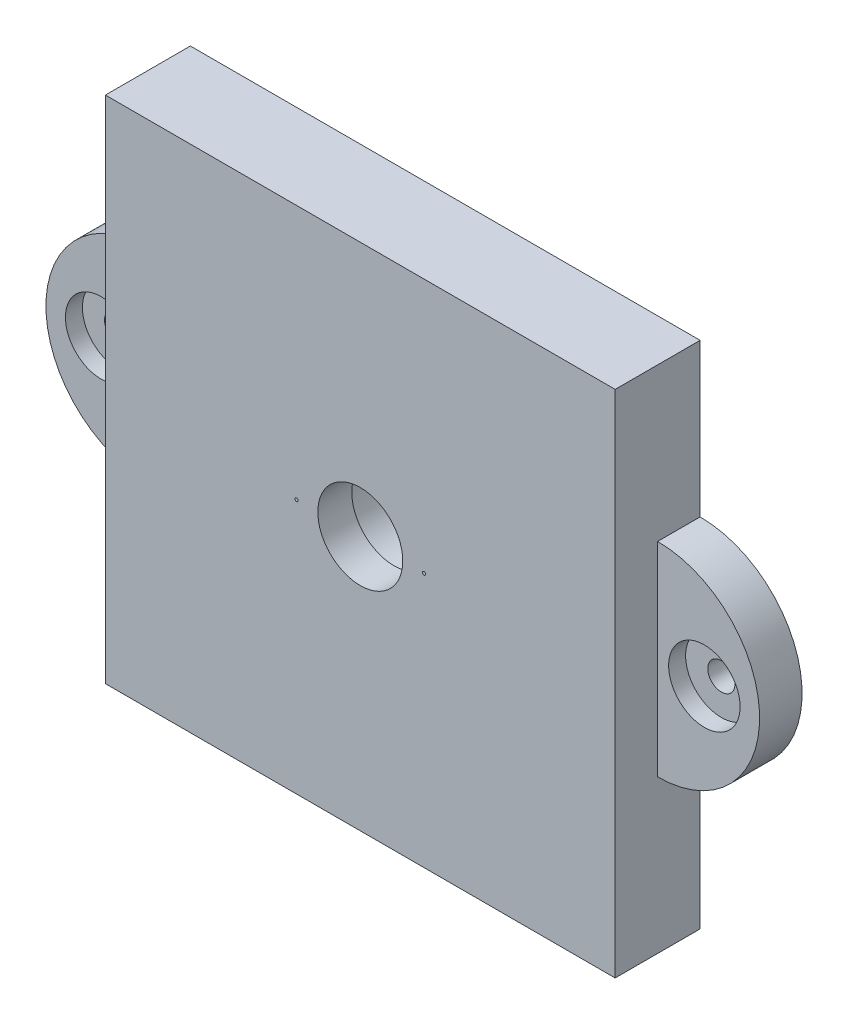
ISO-10303-21;
HEADER;
FILE_DESCRIPTION(('STEP AP214'),'2;1');
FILE_NAME('part.step','',(''),(''),'','','');
FILE_SCHEMA(('AUTOMOTIVE_DESIGN { 1 0 10303 214 1 1 1 1 }'));
ENDSEC;
DATA;
#1=APPLICATION_CONTEXT('core data for automotive mechanical design processes');
#2=APPLICATION_PROTOCOL_DEFINITION('international standard','automotive_design',2000,#1);
#3=PRODUCT_CONTEXT('',#1,'mechanical');
#4=PRODUCT('Part','Part','',(#3));
#5=PRODUCT_RELATED_PRODUCT_CATEGORY('part','',(#4));
#6=PRODUCT_DEFINITION_FORMATION('','',#4);
#7=PRODUCT_DEFINITION_CONTEXT('part definition',#1,'design');
#8=PRODUCT_DEFINITION('design','',#6,#7);
#9=PRODUCT_DEFINITION_SHAPE('','',#8);
#10=(LENGTH_UNIT() NAMED_UNIT(*) SI_UNIT(.MILLI.,.METRE.));
#11=(NAMED_UNIT(*) PLANE_ANGLE_UNIT() SI_UNIT($,.RADIAN.));
#12=(NAMED_UNIT(*) SI_UNIT($,.STERADIAN.) SOLID_ANGLE_UNIT());
#13=UNCERTAINTY_MEASURE_WITH_UNIT(LENGTH_MEASURE(1.E-05),#10,'distance_accuracy_value','');
#14=(GEOMETRIC_REPRESENTATION_CONTEXT(3) GLOBAL_UNCERTAINTY_ASSIGNED_CONTEXT((#13)) GLOBAL_UNIT_ASSIGNED_CONTEXT((#10,
#11,#12)) REPRESENTATION_CONTEXT('',''));
#15=CARTESIAN_POINT('',(0.,0.,0.));
#16=DIRECTION('',(0.,0.,1.));
#17=DIRECTION('',(1.,0.,0.));
#18=AXIS2_PLACEMENT_3D('',#15,#16,#17);
#19=CARTESIAN_POINT('',(0.,0.,6.));
#20=DIRECTION('',(0.,0.,-1.));
#21=DIRECTION('',(-1.,0.,0.));
#22=AXIS2_PLACEMENT_3D('',#19,#20,#21);
#23=PLANE('',#22);
#24=CARTESIAN_POINT('',(-0.751266961285343,-8.15775965528921,6.));
#25=DIRECTION('',(0.,0.,-1.));
#26=DIRECTION('',(-1.,0.,0.));
#27=AXIS2_PLACEMENT_3D('',#24,#25,#26);
#28=CIRCLE('',#27,5.);
#29=CARTESIAN_POINT('',(-5.75126696128534,-8.15775965528921,6.));
#30=VERTEX_POINT('',#29);
#31=EDGE_CURVE('E279',#30,#30,#28,.F.);
#32=ORIENTED_EDGE('',*,*,#31,.T.);
#33=EDGE_LOOP('',(#32));
#34=FACE_BOUND('',#33,.T.);
#35=CARTESIAN_POINT('',(-0.751266961285343,-8.15775965528921,6.));
#36=DIRECTION('',(0.,0.,-1.));
#37=DIRECTION('',(-1.,0.,0.));
#38=AXIS2_PLACEMENT_3D('',#35,#36,#37);
#39=CIRCLE('',#38,5.5);
#40=CARTESIAN_POINT('',(-6.25126696128534,-8.15775965528921,6.));
#41=VERTEX_POINT('',#40);
#42=EDGE_CURVE('E11',#41,#41,#39,.F.);
#43=ORIENTED_EDGE('',*,*,#42,.F.);
#44=EDGE_LOOP('',(#43));
#45=FACE_BOUND('',#44,.T.);
#46=ADVANCED_FACE('F45',(#34,#45),#23,.T.);
#47=CARTESIAN_POINT('',(29.2487330387146,-8.15775965528921,10.));
#48=DIRECTION('',(0.,0.,-1.));
#49=DIRECTION('',(-1.,0.,0.));
#50=AXIS2_PLACEMENT_3D('',#47,#48,#49);
#51=CYLINDRICAL_SURFACE('',#50,12.);
#52=CARTESIAN_POINT('',(29.2487330387146,-8.15775965528921,5.));
#53=DIRECTION('',(0.,0.,1.));
#54=DIRECTION('',(1.,0.,0.));
#55=AXIS2_PLACEMENT_3D('',#52,#53,#54);
#56=CIRCLE('',#55,12.);
#57=CARTESIAN_POINT('',(29.2487330387147,-20.1577596552892,5.));
#58=VERTEX_POINT('',#57);
#59=CARTESIAN_POINT('',(29.2487330387147,3.84224034471079,5.));
#60=VERTEX_POINT('',#59);
#61=EDGE_CURVE('E54',#58,#60,#56,.T.);
#62=ORIENTED_EDGE('',*,*,#61,.F.);
#63=DIRECTION('',(0.,0.,-1.));
#64=VECTOR('',#63,1.);
#65=CARTESIAN_POINT('',(29.2487330387147,-20.1577596552892,10.));
#66=LINE('',#65,#64);
#67=CARTESIAN_POINT('',(29.2487330387147,-20.1577596552892,0.));
#68=VERTEX_POINT('',#67);
#69=EDGE_CURVE('E344',#58,#68,#66,.T.);
#70=ORIENTED_EDGE('',*,*,#69,.T.);
#71=CARTESIAN_POINT('',(29.2487330387146,-8.15775965528921,0.));
#72=DIRECTION('',(0.,0.,1.));
#73=DIRECTION('',(-1.,0.,0.));
#74=AXIS2_PLACEMENT_3D('',#71,#72,#73);
#75=CIRCLE('',#74,12.);
#76=CARTESIAN_POINT('',(29.2487330387147,3.84224034471079,0.));
#77=VERTEX_POINT('',#76);
#78=EDGE_CURVE('E324',#68,#77,#75,.T.);
#79=ORIENTED_EDGE('',*,*,#78,.T.);
#80=DIRECTION('',(0.,0.,-1.));
#81=VECTOR('',#80,1.);
#82=CARTESIAN_POINT('',(29.2487330387147,3.84224034471079,10.));
#83=LINE('',#82,#81);
#84=EDGE_CURVE('E341',#60,#77,#83,.T.);
#85=ORIENTED_EDGE('',*,*,#84,.F.);
#86=EDGE_LOOP('',(#62,#70,#79,#85));
#87=FACE_BOUND('',#86,.T.);
#88=ADVANCED_FACE('F380',(#87),#51,.T.);
#89=CARTESIAN_POINT('',(-0.751266961285343,-8.15775965528921,0.));
#90=DIRECTION('',(0.,0.,1.));
#91=DIRECTION('',(1.,0.,0.));
#92=AXIS2_PLACEMENT_3D('',#89,#90,#91);
#93=CYLINDRICAL_SURFACE('',#92,5.);
#94=CARTESIAN_POINT('',(-0.751266961285343,-8.15775965528921,10.));
#95=DIRECTION('',(0.,0.,1.));
#96=DIRECTION('',(1.,0.,0.));
#97=AXIS2_PLACEMENT_3D('',#94,#95,#96);
#98=CIRCLE('',#97,5.);
#99=CARTESIAN_POINT('',(4.24873303871466,-8.15775965528921,10.));
#100=VERTEX_POINT('',#99);
#101=EDGE_CURVE('E288',#100,#100,#98,.T.);
#102=ORIENTED_EDGE('',*,*,#101,.T.);
#103=EDGE_LOOP('',(#102));
#104=FACE_BOUND('',#103,.T.);
#105=ORIENTED_EDGE('',*,*,#31,.F.);
#106=EDGE_LOOP('',(#105));
#107=FACE_BOUND('',#106,.T.);
#108=ADVANCED_FACE('F435',(#104,#107),#93,.F.);
#109=CARTESIAN_POINT('',(-30.7512669612853,-8.15775965528921,10.));
#110=DIRECTION('',(0.,0.,-1.));
#111=DIRECTION('',(-1.,0.,0.));
#112=AXIS2_PLACEMENT_3D('',#109,#110,#111);
#113=CYLINDRICAL_SURFACE('',#112,12.);
#114=DIRECTION('',(0.,0.,-1.));
#115=VECTOR('',#114,1.);
#116=CARTESIAN_POINT('',(-30.7512669612853,-20.1577596552892,10.));
#117=LINE('',#116,#115);
#118=CARTESIAN_POINT('',(-30.7512669612853,-20.1577596552892,5.));
#119=VERTEX_POINT('',#118);
#120=CARTESIAN_POINT('',(-30.7512669612853,-20.1577596552892,0.));
#121=VERTEX_POINT('',#120);
#122=EDGE_CURVE('E355',#119,#121,#117,.T.);
#123=ORIENTED_EDGE('',*,*,#122,.F.);
#124=CARTESIAN_POINT('',(-30.7512669612853,-8.15775965528921,5.));
#125=DIRECTION('',(0.,0.,-1.));
#126=DIRECTION('',(-1.,0.,0.));
#127=AXIS2_PLACEMENT_3D('',#124,#125,#126);
#128=CIRCLE('',#127,12.);
#129=CARTESIAN_POINT('',(-30.7512669612853,3.84224034471079,5.));
#130=VERTEX_POINT('',#129);
#131=EDGE_CURVE('E229',#119,#130,#128,.T.);
#132=ORIENTED_EDGE('',*,*,#131,.T.);
#133=DIRECTION('',(0.,0.,-1.));
#134=VECTOR('',#133,1.);
#135=CARTESIAN_POINT('',(-30.7512669612853,3.84224034471079,10.));
#136=LINE('',#135,#134);
#137=CARTESIAN_POINT('',(-30.7512669612853,3.84224034471079,0.));
#138=VERTEX_POINT('',#137);
#139=EDGE_CURVE('E358',#130,#138,#136,.T.);
#140=ORIENTED_EDGE('',*,*,#139,.T.);
#141=CARTESIAN_POINT('',(-30.7512669612853,-8.15775965528921,0.));
#142=DIRECTION('',(0.,0.,1.));
#143=DIRECTION('',(-1.,0.,0.));
#144=AXIS2_PLACEMENT_3D('',#141,#142,#143);
#145=CIRCLE('',#144,12.);
#146=EDGE_CURVE('E310',#138,#121,#145,.T.);
#147=ORIENTED_EDGE('',*,*,#146,.T.);
#148=EDGE_LOOP('',(#123,#132,#140,#147));
#149=FACE_BOUND('',#148,.T.);
#150=ADVANCED_FACE('F47',(#149),#113,.T.);
#151=CARTESIAN_POINT('',(-30.7512669612853,-20.1577596552892,10.));
#152=DIRECTION('',(1.,0.,0.));
#153=DIRECTION('',(0.,1.,0.));
#154=AXIS2_PLACEMENT_3D('',#151,#152,#153);
#155=PLANE('',#154);
#156=DIRECTION('',(0.,0.,-1.));
#157=VECTOR('',#156,1.);
#158=CARTESIAN_POINT('',(-30.7512669612853,-38.1577596552892,10.));
#159=LINE('',#158,#157);
#160=CARTESIAN_POINT('',(-30.7512669612853,-38.1577596552892,10.));
#161=VERTEX_POINT('',#160);
#162=CARTESIAN_POINT('',(-30.7512669612853,-38.1577596552892,0.));
#163=VERTEX_POINT('',#162);
#164=EDGE_CURVE('E351',#161,#163,#159,.T.);
#165=ORIENTED_EDGE('',*,*,#164,.F.);
#166=DIRECTION('',(0.,-1.,0.));
#167=VECTOR('',#166,1.);
#168=CARTESIAN_POINT('',(-30.7512669612853,21.8422403447108,10.));
#169=LINE('',#168,#167);
#170=CARTESIAN_POINT('',(-30.7512669612853,21.8422403447108,10.));
#171=VERTEX_POINT('',#170);
#172=EDGE_CURVE('E293',#171,#161,#169,.T.);
#173=ORIENTED_EDGE('',*,*,#172,.F.);
#174=DIRECTION('',(0.,0.,-1.));
#175=VECTOR('',#174,1.);
#176=CARTESIAN_POINT('',(-30.7512669612853,21.8422403447108,10.));
#177=LINE('',#176,#175);
#178=CARTESIAN_POINT('',(-30.7512669612853,21.8422403447108,0.));
#179=VERTEX_POINT('',#178);
#180=EDGE_CURVE('E306',#171,#179,#177,.T.);
#181=ORIENTED_EDGE('',*,*,#180,.T.);
#182=DIRECTION('',(0.,-1.,0.));
#183=VECTOR('',#182,1.);
#184=CARTESIAN_POINT('',(-30.7512669612853,21.8422403447108,0.));
#185=LINE('',#184,#183);
#186=EDGE_CURVE('E292',#179,#138,#185,.T.);
#187=ORIENTED_EDGE('',*,*,#186,.T.);
#188=ORIENTED_EDGE('',*,*,#139,.F.);
#189=DIRECTION('',(0.,1.,0.));
#190=VECTOR('',#189,1.);
#191=CARTESIAN_POINT('',(-30.7512669612853,3.84224034471079,5.));
#192=LINE('',#191,#190);
#193=EDGE_CURVE('E226',#119,#130,#192,.T.);
#194=ORIENTED_EDGE('',*,*,#193,.F.);
#195=ORIENTED_EDGE('',*,*,#122,.T.);
#196=DIRECTION('',(0.,-1.,0.));
#197=VECTOR('',#196,1.);
#198=CARTESIAN_POINT('',(-30.7512669612853,-20.1577596552892,0.));
#199=LINE('',#198,#197);
#200=EDGE_CURVE('E314',#121,#163,#199,.T.);
#201=ORIENTED_EDGE('',*,*,#200,.T.);
#202=EDGE_LOOP('',(#165,#173,#181,#187,#188,#194,#195,#201));
#203=FACE_BOUND('',#202,.T.);
#204=ADVANCED_FACE('F404',(#203),#155,.F.);
#205=CARTESIAN_POINT('',(-30.7512669612853,-38.1577596552892,10.));
#206=DIRECTION('',(0.,1.,0.));
#207=DIRECTION('',(0.,0.,1.));
#208=AXIS2_PLACEMENT_3D('',#205,#206,#207);
#209=PLANE('',#208);
#210=DIRECTION('',(1.,0.,0.));
#211=VECTOR('',#210,1.);
#212=CARTESIAN_POINT('',(-30.7512669612853,-38.1577596552892,0.));
#213=LINE('',#212,#211);
#214=CARTESIAN_POINT('',(29.2487330387147,-38.1577596552892,0.));
#215=VERTEX_POINT('',#214);
#216=EDGE_CURVE('E317',#163,#215,#213,.T.);
#217=ORIENTED_EDGE('',*,*,#216,.T.);
#218=DIRECTION('',(0.,0.,-1.));
#219=VECTOR('',#218,1.);
#220=CARTESIAN_POINT('',(29.2487330387147,-38.1577596552892,10.));
#221=LINE('',#220,#219);
#222=CARTESIAN_POINT('',(29.2487330387147,-38.1577596552892,10.));
#223=VERTEX_POINT('',#222);
#224=EDGE_CURVE('E347',#223,#215,#221,.T.);
#225=ORIENTED_EDGE('',*,*,#224,.F.);
#226=DIRECTION('',(1.,0.,0.));
#227=VECTOR('',#226,1.);
#228=CARTESIAN_POINT('',(-30.7512669612853,-38.1577596552892,10.));
#229=LINE('',#228,#227);
#230=EDGE_CURVE('E296',#161,#223,#229,.T.);
#231=ORIENTED_EDGE('',*,*,#230,.F.);
#232=ORIENTED_EDGE('',*,*,#164,.T.);
#233=EDGE_LOOP('',(#217,#225,#231,#232));
#234=FACE_BOUND('',#233,.T.);
#235=ADVANCED_FACE('F402',(#234),#209,.F.);
#236=CARTESIAN_POINT('',(29.2487330387146,21.8422403447108,10.));
#237=DIRECTION('',(-1.,0.,0.));
#238=DIRECTION('',(0.,-1.,0.));
#239=AXIS2_PLACEMENT_3D('',#236,#237,#238);
#240=PLANE('',#239);
#241=DIRECTION('',(0.,0.,-1.));
#242=VECTOR('',#241,1.);
#243=CARTESIAN_POINT('',(29.2487330387146,21.8422403447108,10.));
#244=LINE('',#243,#242);
#245=CARTESIAN_POINT('',(29.2487330387146,21.8422403447108,10.));
#246=VERTEX_POINT('',#245);
#247=CARTESIAN_POINT('',(29.2487330387146,21.8422403447108,0.));
#248=VERTEX_POINT('',#247);
#249=EDGE_CURVE('E337',#246,#248,#244,.T.);
#250=ORIENTED_EDGE('',*,*,#249,.F.);
#251=DIRECTION('',(0.,1.,0.));
#252=VECTOR('',#251,1.);
#253=CARTESIAN_POINT('',(29.2487330387147,-20.1577596552892,10.));
#254=LINE('',#253,#252);
#255=EDGE_CURVE('E300',#223,#246,#254,.T.);
#256=ORIENTED_EDGE('',*,*,#255,.F.);
#257=ORIENTED_EDGE('',*,*,#224,.T.);
#258=DIRECTION('',(0.,1.,0.));
#259=VECTOR('',#258,1.);
#260=CARTESIAN_POINT('',(29.2487330387147,-20.1577596552892,0.));
#261=LINE('',#260,#259);
#262=EDGE_CURVE('E320',#215,#68,#261,.T.);
#263=ORIENTED_EDGE('',*,*,#262,.T.);
#264=ORIENTED_EDGE('',*,*,#69,.F.);
#265=DIRECTION('',(0.,-1.,0.));
#266=VECTOR('',#265,1.);
#267=CARTESIAN_POINT('',(29.2487330387147,3.84224034471079,5.));
#268=LINE('',#267,#266);
#269=EDGE_CURVE('E225',#60,#58,#268,.T.);
#270=ORIENTED_EDGE('',*,*,#269,.F.);
#271=ORIENTED_EDGE('',*,*,#84,.T.);
#272=DIRECTION('',(0.,1.,0.));
#273=VECTOR('',#272,1.);
#274=CARTESIAN_POINT('',(29.2487330387146,21.8422403447108,0.));
#275=LINE('',#274,#273);
#276=EDGE_CURVE('E328',#77,#248,#275,.T.);
#277=ORIENTED_EDGE('',*,*,#276,.T.);
#278=EDGE_LOOP('',(#250,#256,#257,#263,#264,#270,#271,#277));
#279=FACE_BOUND('',#278,.T.);
#280=ADVANCED_FACE('F379',(#279),#240,.F.);
#281=CARTESIAN_POINT('',(-30.7512669612853,21.8422403447108,10.));
#282=DIRECTION('',(0.,-1.,0.));
#283=DIRECTION('',(0.,0.,-1.));
#284=AXIS2_PLACEMENT_3D('',#281,#282,#283);
#285=PLANE('',#284);
#286=DIRECTION('',(-1.,0.,0.));
#287=VECTOR('',#286,1.);
#288=CARTESIAN_POINT('',(-30.7512669612853,21.8422403447108,0.));
#289=LINE('',#288,#287);
#290=EDGE_CURVE('E297',#248,#179,#289,.T.);
#291=ORIENTED_EDGE('',*,*,#290,.T.);
#292=ORIENTED_EDGE('',*,*,#180,.F.);
#293=DIRECTION('',(-1.,0.,0.));
#294=VECTOR('',#293,1.);
#295=CARTESIAN_POINT('',(1.24873303871465,21.8422403447108,10.));
#296=LINE('',#295,#294);
#297=EDGE_CURVE('E303',#246,#171,#296,.T.);
#298=ORIENTED_EDGE('',*,*,#297,.F.);
#299=ORIENTED_EDGE('',*,*,#249,.T.);
#300=EDGE_LOOP('',(#291,#292,#298,#299));
#301=FACE_BOUND('',#300,.T.);
#302=ADVANCED_FACE('F390',(#301),#285,.F.);
#303=CARTESIAN_POINT('',(-30.7512669612853,-8.15775965528921,10.));
#304=DIRECTION('',(0.,0.,-1.));
#305=DIRECTION('',(-1.,0.,0.));
#306=AXIS2_PLACEMENT_3D('',#303,#304,#305);
#307=PLANE('',#306);
#308=CARTESIAN_POINT('',(-8.25126696128534,-8.15775965528921,10.));
#309=DIRECTION('',(0.,0.,-1.));
#310=DIRECTION('',(-1.,0.,0.));
#311=AXIS2_PLACEMENT_3D('',#308,#309,#310);
#312=CIRCLE('',#311,0.185720517649482);
#313=CARTESIAN_POINT('',(-8.43698747893482,-8.15775965528921,10.));
#314=VERTEX_POINT('',#313);
#315=EDGE_CURVE('E239',#314,#314,#312,.T.);
#316=ORIENTED_EDGE('',*,*,#315,.T.);
#317=EDGE_LOOP('',(#316));
#318=FACE_BOUND('',#317,.T.);
#319=CARTESIAN_POINT('',(6.74873303871466,-8.15775965528921,10.));
#320=DIRECTION('',(0.,0.,-1.));
#321=DIRECTION('',(-1.,0.,0.));
#322=AXIS2_PLACEMENT_3D('',#319,#320,#321);
#323=CIRCLE('',#322,0.185720517649481);
#324=CARTESIAN_POINT('',(6.56301252106518,-8.15775965528921,10.));
#325=VERTEX_POINT('',#324);
#326=EDGE_CURVE('E244',#325,#325,#323,.T.);
#327=ORIENTED_EDGE('',*,*,#326,.T.);
#328=EDGE_LOOP('',(#327));
#329=FACE_BOUND('',#328,.T.);
#330=ORIENTED_EDGE('',*,*,#101,.F.);
#331=EDGE_LOOP('',(#330));
#332=FACE_BOUND('',#331,.T.);
#333=ORIENTED_EDGE('',*,*,#172,.T.);
#334=ORIENTED_EDGE('',*,*,#230,.T.);
#335=ORIENTED_EDGE('',*,*,#255,.T.);
#336=ORIENTED_EDGE('',*,*,#297,.T.);
#337=EDGE_LOOP('',(#333,#334,#335,#336));
#338=FACE_BOUND('',#337,.T.);
#339=ADVANCED_FACE('F394',(#318,#329,#332,#338),#307,.F.);
#340=CARTESIAN_POINT('',(-30.7512669612853,-8.15775965528921,0.));
#341=DIRECTION('',(0.,0.,-1.));
#342=DIRECTION('',(-1.,0.,0.));
#343=AXIS2_PLACEMENT_3D('',#340,#341,#342);
#344=PLANE('',#343);
#345=CARTESIAN_POINT('',(34.7487330387147,-8.15775965528921,0.));
#346=DIRECTION('',(0.,0.,1.));
#347=DIRECTION('',(1.,0.,0.));
#348=AXIS2_PLACEMENT_3D('',#345,#346,#347);
#349=CIRCLE('',#348,1.6);
#350=CARTESIAN_POINT('',(36.3487330387146,-8.15775965528921,0.));
#351=VERTEX_POINT('',#350);
#352=EDGE_CURVE('E205',#351,#351,#349,.T.);
#353=ORIENTED_EDGE('',*,*,#352,.T.);
#354=EDGE_LOOP('',(#353));
#355=FACE_BOUND('',#354,.T.);
#356=CARTESIAN_POINT('',(-36.2512669612853,-8.15775965528921,0.));
#357=DIRECTION('',(0.,0.,1.));
#358=DIRECTION('',(1.,0.,0.));
#359=AXIS2_PLACEMENT_3D('',#356,#357,#358);
#360=CIRCLE('',#359,1.6);
#361=CARTESIAN_POINT('',(-34.6512669612853,-8.15775965528921,0.));
#362=VERTEX_POINT('',#361);
#363=EDGE_CURVE('E221',#362,#362,#360,.T.);
#364=ORIENTED_EDGE('',*,*,#363,.T.);
#365=EDGE_LOOP('',(#364));
#366=FACE_BOUND('',#365,.T.);
#367=DIRECTION('',(0.,-1.,0.));
#368=VECTOR('',#367,1.);
#369=CARTESIAN_POINT('',(27.2487330387147,19.8422403447108,0.));
#370=LINE('',#369,#368);
#371=CARTESIAN_POINT('',(27.2487330387147,19.8422403447108,0.));
#372=VERTEX_POINT('',#371);
#373=CARTESIAN_POINT('',(27.2487330387146,-36.1577596552892,0.));
#374=VERTEX_POINT('',#373);
#375=EDGE_CURVE('E69',#372,#374,#370,.T.);
#376=ORIENTED_EDGE('',*,*,#375,.F.);
#377=DIRECTION('',(1.,0.,0.));
#378=VECTOR('',#377,1.);
#379=CARTESIAN_POINT('',(27.2487330387147,19.8422403447108,0.));
#380=LINE('',#379,#378);
#381=CARTESIAN_POINT('',(-28.7512669612853,19.8422403447108,0.));
#382=VERTEX_POINT('',#381);
#383=EDGE_CURVE('E250',#382,#372,#380,.T.);
#384=ORIENTED_EDGE('',*,*,#383,.F.);
#385=DIRECTION('',(0.,1.,0.));
#386=VECTOR('',#385,1.);
#387=CARTESIAN_POINT('',(-28.7512669612853,19.8422403447108,0.));
#388=LINE('',#387,#386);
#389=CARTESIAN_POINT('',(-28.7512669612853,-36.1577596552892,0.));
#390=VERTEX_POINT('',#389);
#391=EDGE_CURVE('E269',#390,#382,#388,.T.);
#392=ORIENTED_EDGE('',*,*,#391,.F.);
#393=DIRECTION('',(-1.,0.,0.));
#394=VECTOR('',#393,1.);
#395=CARTESIAN_POINT('',(27.2487330387146,-36.1577596552892,0.));
#396=LINE('',#395,#394);
#397=EDGE_CURVE('E265',#374,#390,#396,.T.);
#398=ORIENTED_EDGE('',*,*,#397,.F.);
#399=EDGE_LOOP('',(#376,#384,#392,#398));
#400=FACE_BOUND('',#399,.T.);
#401=ORIENTED_EDGE('',*,*,#186,.F.);
#402=ORIENTED_EDGE('',*,*,#290,.F.);
#403=ORIENTED_EDGE('',*,*,#276,.F.);
#404=ORIENTED_EDGE('',*,*,#78,.F.);
#405=ORIENTED_EDGE('',*,*,#262,.F.);
#406=ORIENTED_EDGE('',*,*,#216,.F.);
#407=ORIENTED_EDGE('',*,*,#200,.F.);
#408=ORIENTED_EDGE('',*,*,#146,.F.);
#409=EDGE_LOOP('',(#401,#402,#403,#404,#405,#406,#407,#408));
#410=FACE_BOUND('',#409,.T.);
#411=ADVANCED_FACE('F386',(#355,#366,#400,#410),#344,.T.);
#412=DIRECTION('',(0.,-1.,0.));
#413=VECTOR('',#412,1.);
#414=CARTESIAN_POINT('',(13.2487330387147,-0.157759655289209,6.));
#415=LINE('',#414,#413);
#416=CARTESIAN_POINT('',(13.2487330387147,-0.157759655289209,6.));
#417=VERTEX_POINT('',#416);
#418=CARTESIAN_POINT('',(13.2487330387147,-16.1577596552892,6.));
#419=VERTEX_POINT('',#418);
#420=EDGE_CURVE('E453',#417,#419,#415,.T.);
#421=ORIENTED_EDGE('',*,*,#420,.F.);
#422=DIRECTION('',(1.,0.,0.));
#423=VECTOR('',#422,1.);
#424=CARTESIAN_POINT('',(13.2487330387147,-0.157759655289209,6.));
#425=LINE('',#424,#423);
#426=CARTESIAN_POINT('',(-14.7512669612853,-0.157759655289209,6.));
#427=VERTEX_POINT('',#426);
#428=EDGE_CURVE('E185',#427,#417,#425,.T.);
#429=ORIENTED_EDGE('',*,*,#428,.F.);
#430=DIRECTION('',(0.,1.,0.));
#431=VECTOR('',#430,1.);
#432=CARTESIAN_POINT('',(-14.7512669612853,-0.157759655289209,6.));
#433=LINE('',#432,#431);
#434=CARTESIAN_POINT('',(-14.7512669612854,-16.1577596552892,6.));
#435=VERTEX_POINT('',#434);
#436=EDGE_CURVE('E181',#435,#427,#433,.T.);
#437=ORIENTED_EDGE('',*,*,#436,.F.);
#438=DIRECTION('',(-1.,0.,0.));
#439=VECTOR('',#438,1.);
#440=CARTESIAN_POINT('',(13.2487330387147,-16.1577596552892,6.));
#441=LINE('',#440,#439);
#442=EDGE_CURVE('E756',#419,#435,#441,.T.);
#443=ORIENTED_EDGE('',*,*,#442,.F.);
#444=EDGE_LOOP('',(#421,#429,#437,#443));
#445=FACE_BOUND('',#444,.T.);
#446=DIRECTION('',(0.,-1.,0.));
#447=VECTOR('',#446,1.);
#448=CARTESIAN_POINT('',(27.2487330387147,19.8422403447108,6.));
#449=LINE('',#448,#447);
#450=CARTESIAN_POINT('',(27.2487330387147,19.8422403447108,6.));
#451=VERTEX_POINT('',#450);
#452=CARTESIAN_POINT('',(27.2487330387146,-36.1577596552892,6.));
#453=VERTEX_POINT('',#452);
#454=EDGE_CURVE('E245',#451,#453,#449,.T.);
#455=ORIENTED_EDGE('',*,*,#454,.T.);
#456=DIRECTION('',(-1.,0.,0.));
#457=VECTOR('',#456,1.);
#458=CARTESIAN_POINT('',(27.2487330387146,-36.1577596552892,6.));
#459=LINE('',#458,#457);
#460=CARTESIAN_POINT('',(-28.7512669612853,-36.1577596552892,6.));
#461=VERTEX_POINT('',#460);
#462=EDGE_CURVE('E249',#453,#461,#459,.T.);
#463=ORIENTED_EDGE('',*,*,#462,.T.);
#464=DIRECTION('',(0.,1.,0.));
#465=VECTOR('',#464,1.);
#466=CARTESIAN_POINT('',(-28.7512669612853,19.8422403447108,6.));
#467=LINE('',#466,#465);
#468=CARTESIAN_POINT('',(-28.7512669612853,19.8422403447108,6.));
#469=VERTEX_POINT('',#468);
#470=EDGE_CURVE('E254',#461,#469,#467,.T.);
#471=ORIENTED_EDGE('',*,*,#470,.T.);
#472=DIRECTION('',(1.,0.,0.));
#473=VECTOR('',#472,1.);
#474=CARTESIAN_POINT('',(27.2487330387147,19.8422403447108,6.));
#475=LINE('',#474,#473);
#476=EDGE_CURVE('E258',#469,#451,#475,.T.);
#477=ORIENTED_EDGE('',*,*,#476,.T.);
#478=EDGE_LOOP('',(#455,#463,#471,#477));
#479=FACE_BOUND('',#478,.T.);
#480=ADVANCED_FACE('F429',(#445,#479),#23,.T.);
#481=CARTESIAN_POINT('',(27.2487330387147,19.8422403447108,6.));
#482=DIRECTION('',(1.,0.,0.));
#483=DIRECTION('',(0.,1.,0.));
#484=AXIS2_PLACEMENT_3D('',#481,#482,#483);
#485=PLANE('',#484);
#486=ORIENTED_EDGE('',*,*,#375,.T.);
#487=DIRECTION('',(0.,0.,-1.));
#488=VECTOR('',#487,1.);
#489=CARTESIAN_POINT('',(27.2487330387146,-36.1577596552892,6.));
#490=LINE('',#489,#488);
#491=EDGE_CURVE('E262',#453,#374,#490,.T.);
#492=ORIENTED_EDGE('',*,*,#491,.F.);
#493=ORIENTED_EDGE('',*,*,#454,.F.);
#494=DIRECTION('',(0.,0.,-1.));
#495=VECTOR('',#494,1.);
#496=CARTESIAN_POINT('',(27.2487330387147,19.8422403447108,6.));
#497=LINE('',#496,#495);
#498=EDGE_CURVE('E276',#451,#372,#497,.T.);
#499=ORIENTED_EDGE('',*,*,#498,.T.);
#500=EDGE_LOOP('',(#486,#492,#493,#499));
#501=FACE_BOUND('',#500,.T.);
#502=ADVANCED_FACE('F440',(#501),#485,.F.);
#503=CARTESIAN_POINT('',(27.2487330387147,19.8422403447108,6.));
#504=DIRECTION('',(0.,1.,0.));
#505=DIRECTION('',(0.,0.,1.));
#506=AXIS2_PLACEMENT_3D('',#503,#504,#505);
#507=PLANE('',#506);
#508=ORIENTED_EDGE('',*,*,#383,.T.);
#509=ORIENTED_EDGE('',*,*,#498,.F.);
#510=ORIENTED_EDGE('',*,*,#476,.F.);
#511=DIRECTION('',(0.,0.,-1.));
#512=VECTOR('',#511,1.);
#513=CARTESIAN_POINT('',(-28.7512669612853,19.8422403447108,6.));
#514=LINE('',#513,#512);
#515=EDGE_CURVE('E280',#469,#382,#514,.T.);
#516=ORIENTED_EDGE('',*,*,#515,.T.);
#517=EDGE_LOOP('',(#508,#509,#510,#516));
#518=FACE_BOUND('',#517,.T.);
#519=ADVANCED_FACE('F446',(#518),#507,.F.);
#520=CARTESIAN_POINT('',(-28.7512669612853,19.8422403447108,6.));
#521=DIRECTION('',(-1.,0.,0.));
#522=DIRECTION('',(0.,-1.,0.));
#523=AXIS2_PLACEMENT_3D('',#520,#521,#522);
#524=PLANE('',#523);
#525=ORIENTED_EDGE('',*,*,#391,.T.);
#526=ORIENTED_EDGE('',*,*,#515,.F.);
#527=ORIENTED_EDGE('',*,*,#470,.F.);
#528=DIRECTION('',(0.,0.,-1.));
#529=VECTOR('',#528,1.);
#530=CARTESIAN_POINT('',(-28.7512669612853,-36.1577596552892,6.));
#531=LINE('',#530,#529);
#532=EDGE_CURVE('E283',#461,#390,#531,.T.);
#533=ORIENTED_EDGE('',*,*,#532,.T.);
#534=EDGE_LOOP('',(#525,#526,#527,#533));
#535=FACE_BOUND('',#534,.T.);
#536=ADVANCED_FACE('F463',(#535),#524,.F.);
#537=CARTESIAN_POINT('',(27.2487330387146,-36.1577596552892,6.));
#538=DIRECTION('',(0.,-1.,0.));
#539=DIRECTION('',(0.,0.,-1.));
#540=AXIS2_PLACEMENT_3D('',#537,#538,#539);
#541=PLANE('',#540);
#542=ORIENTED_EDGE('',*,*,#397,.T.);
#543=ORIENTED_EDGE('',*,*,#532,.F.);
#544=ORIENTED_EDGE('',*,*,#462,.F.);
#545=ORIENTED_EDGE('',*,*,#491,.T.);
#546=EDGE_LOOP('',(#542,#543,#544,#545));
#547=FACE_BOUND('',#546,.T.);
#548=ADVANCED_FACE('F459',(#547),#541,.F.);
#549=CARTESIAN_POINT('',(6.74873303871466,-8.15775965528921,9.));
#550=DIRECTION('',(0.,0.,-1.));
#551=DIRECTION('',(-1.,0.,0.));
#552=AXIS2_PLACEMENT_3D('',#549,#550,#551);
#553=CONICAL_SURFACE('',#552,1.85,1.02974425867665);
#554=CARTESIAN_POINT('',(6.74873303871466,-8.15775965528921,9.));
#555=DIRECTION('',(0.,0.,-1.));
#556=DIRECTION('',(-1.,0.,0.));
#557=AXIS2_PLACEMENT_3D('',#554,#555,#556);
#558=CIRCLE('',#557,1.85);
#559=CARTESIAN_POINT('',(4.89873303871466,-8.15775965528921,9.));
#560=VERTEX_POINT('',#559);
#561=EDGE_CURVE('E240',#560,#560,#558,.T.);
#562=CARTESIAN_POINT('',(4.89873303871466,-8.15775965528921,9.));
#563=CARTESIAN_POINT('',(4.91606928332248,-8.15775965528921,9.01041666666667));
#564=CARTESIAN_POINT('',(4.93340552793029,-8.15775965528921,9.02083333333333));
#565=CARTESIAN_POINT('',(4.96807801714593,-8.15775965528921,9.04166666666667));
#566=CARTESIAN_POINT('',(4.98541426175375,-8.15775965528921,9.05208333333333));
#567=CARTESIAN_POINT('',(5.02008675096938,-8.15775965528921,9.07291666666667));
#568=CARTESIAN_POINT('',(5.0374229955772,-8.15775965528921,9.08333333333333));
#569=CARTESIAN_POINT('',(5.07209548479284,-8.15775965528921,9.10416666666667));
#570=CARTESIAN_POINT('',(5.08943172940066,-8.15775965528921,9.11458333333333));
#571=CARTESIAN_POINT('',(5.12410421861629,-8.15775965528921,9.13541666666667));
#572=CARTESIAN_POINT('',(5.14144046322411,-8.15775965528921,9.14583333333333));
#573=CARTESIAN_POINT('',(5.17611295243975,-8.15775965528921,9.16666666666667));
#574=CARTESIAN_POINT('',(5.19344919704756,-8.15775965528921,9.17708333333333));
#575=CARTESIAN_POINT('',(5.2281216862632,-8.15775965528921,9.19791666666667));
#576=CARTESIAN_POINT('',(5.24545793087102,-8.15775965528921,9.20833333333333));
#577=CARTESIAN_POINT('',(5.28013042008665,-8.15775965528921,9.22916666666667));
#578=CARTESIAN_POINT('',(5.29746666469447,-8.15775965528921,9.23958333333333));
#579=CARTESIAN_POINT('',(5.33213915391011,-8.15775965528921,9.26041666666667));
#580=CARTESIAN_POINT('',(5.34947539851792,-8.15775965528921,9.27083333333333));
#581=CARTESIAN_POINT('',(5.38414788773356,-8.15775965528921,9.29166666666667));
#582=CARTESIAN_POINT('',(5.40148413234138,-8.15775965528921,9.30208333333333));
#583=CARTESIAN_POINT('',(5.43615662155701,-8.15775965528921,9.32291666666667));
#584=CARTESIAN_POINT('',(5.45349286616483,-8.15775965528921,9.33333333333333));
#585=CARTESIAN_POINT('',(5.48816535538047,-8.15775965528921,9.35416666666667));
#586=CARTESIAN_POINT('',(5.50550159998829,-8.15775965528921,9.36458333333333));
#587=CARTESIAN_POINT('',(5.54017408920392,-8.15775965528921,9.38541666666667));
#588=CARTESIAN_POINT('',(5.55751033381174,-8.15775965528921,9.39583333333333));
#589=CARTESIAN_POINT('',(5.59218282302737,-8.15775965528921,9.41666666666667));
#590=CARTESIAN_POINT('',(5.60951906763519,-8.15775965528921,9.42708333333333));
#591=CARTESIAN_POINT('',(5.64419155685083,-8.15775965528921,9.44791666666667));
#592=CARTESIAN_POINT('',(5.66152780145865,-8.15775965528921,9.45833333333333));
#593=CARTESIAN_POINT('',(5.69620029067428,-8.15775965528921,9.47916666666667));
#594=CARTESIAN_POINT('',(5.7135365352821,-8.15775965528921,9.48958333333333));
#595=CARTESIAN_POINT('',(5.74820902449774,-8.15775965528921,9.51041666666667));
#596=CARTESIAN_POINT('',(5.76554526910555,-8.15775965528921,9.52083333333333));
#597=CARTESIAN_POINT('',(5.80021775832119,-8.15775965528921,9.54166666666667));
#598=CARTESIAN_POINT('',(5.81755400292901,-8.15775965528921,9.55208333333333));
#599=CARTESIAN_POINT('',(5.85222649214464,-8.15775965528921,9.57291666666667));
#600=CARTESIAN_POINT('',(5.86956273675246,-8.15775965528921,9.58333333333333));
#601=CARTESIAN_POINT('',(5.9042352259681,-8.15775965528921,9.60416666666667));
#602=CARTESIAN_POINT('',(5.92157147057591,-8.15775965528921,9.61458333333333));
#603=CARTESIAN_POINT('',(5.95624395979155,-8.15775965528921,9.63541666666667));
#604=CARTESIAN_POINT('',(5.97358020439937,-8.15775965528921,9.64583333333333));
#605=CARTESIAN_POINT('',(6.008252693615,-8.15775965528921,9.66666666666667));
#606=CARTESIAN_POINT('',(6.02558893822282,-8.15775965528921,9.67708333333333));
#607=CARTESIAN_POINT('',(6.06026142743846,-8.15775965528921,9.69791666666667));
#608=CARTESIAN_POINT('',(6.07759767204628,-8.15775965528921,9.70833333333333));
#609=CARTESIAN_POINT('',(6.11227016126191,-8.15775965528921,9.72916666666667));
#610=CARTESIAN_POINT('',(6.12960640586973,-8.15775965528921,9.73958333333333));
#611=CARTESIAN_POINT('',(6.16427889508537,-8.15775965528921,9.76041666666667));
#612=CARTESIAN_POINT('',(6.18161513969318,-8.15775965528921,9.77083333333333));
#613=CARTESIAN_POINT('',(6.21628762890882,-8.15775965528921,9.79166666666667));
#614=CARTESIAN_POINT('',(6.23362387351664,-8.15775965528921,9.80208333333333));
#615=CARTESIAN_POINT('',(6.26829636273227,-8.15775965528921,9.82291666666667));
#616=CARTESIAN_POINT('',(6.28563260734009,-8.15775965528921,9.83333333333333));
#617=CARTESIAN_POINT('',(6.32030509655573,-8.15775965528921,9.85416666666667));
#618=CARTESIAN_POINT('',(6.33764134116354,-8.15775965528921,9.86458333333333));
#619=CARTESIAN_POINT('',(6.37231383037918,-8.15775965528921,9.88541666666667));
#620=CARTESIAN_POINT('',(6.389650074987,-8.15775965528921,9.89583333333333));
#621=CARTESIAN_POINT('',(6.42432256420263,-8.15775965528921,9.91666666666667));
#622=CARTESIAN_POINT('',(6.44165880881045,-8.15775965528921,9.92708333333333));
#623=CARTESIAN_POINT('',(6.47633129802609,-8.15775965528921,9.94791666666667));
#624=CARTESIAN_POINT('',(6.49366754263391,-8.15775965528921,9.95833333333333));
#625=CARTESIAN_POINT('',(6.52834003184954,-8.15775965528921,9.97916666666667));
#626=CARTESIAN_POINT('',(6.54567627645736,-8.15775965528921,9.98958333333333));
#627=CARTESIAN_POINT('',(6.56301252106518,-8.15775965528921,10.));
#628=B_SPLINE_CURVE_WITH_KNOTS('',3,(#562,#563,#564,#565,#566,#567,#568,#569,#570,#571,#572,
#573,#574,#575,#576,#577,#578,#579,#580,#581,#582,#583,#584,#585,#586,#587,#588,#589,#590,#591,
#592,#593,#594,#595,#596,#597,#598,#599,#600,#601,#602,#603,#604,#605,#606,#607,#608,#609,#610,
#611,#612,#613,#614,#615,#616,#617,#618,#619,#620,#621,#622,#623,#624,#625,#626,#627),
.UNSPECIFIED.,.F.,.F.,(4,2,2,2,2,2,2,2,2,2,2,2,2,2,2,2,2,2,2,2,2,2,2,2,2,2,2,2,2,2,2,2,4),(0.,
0.0606751258253235,0.121350251650647,0.182025377475971,0.242700503301295,0.303375629126618,
0.364050754951942,0.424725880777265,0.485401006602589,0.546076132427913,0.606751258253236,
0.66742638407856,0.728101509903884,0.788776635729208,0.849451761554532,0.910126887379854,
0.970802013205179,1.0314771390305,1.09215226485583,1.15282739068115,1.21350251650647,
1.2741776423318,1.33485276815712,1.39552789398244,1.45620301980777,1.51687814563309,
1.57755327145842,1.63822839728374,1.69890352310906,1.75957864893439,1.82025377475971,
1.88092890058503,1.94160402641036),.UNSPECIFIED.);
#629=EDGE_CURVE('BSEAM474',#560,#325,#628,.T.);
#630=ORIENTED_EDGE('',*,*,#561,.T.);
#631=ORIENTED_EDGE('',*,*,#326,.F.);
#632=ORIENTED_EDGE('',*,*,#629,.T.);
#633=ORIENTED_EDGE('',*,*,#629,.F.);
#634=EDGE_LOOP('',(#630,#632,#631,#633));
#635=FACE_BOUND('',#634,.T.);
#636=ADVANCED_FACE('F474',(#635),#553,.F.);
#637=CARTESIAN_POINT('',(6.74873303871466,-8.15775965528921,6.));
#638=DIRECTION('',(0.,0.,-1.));
#639=DIRECTION('',(-1.,0.,0.));
#640=AXIS2_PLACEMENT_3D('',#637,#638,#639);
#641=CYLINDRICAL_SURFACE('',#640,1.84999999999999);
#642=ORIENTED_EDGE('',*,*,#561,.F.);
#643=EDGE_LOOP('',(#642));
#644=FACE_BOUND('',#643,.T.);
#645=CARTESIAN_POINT('',(6.74873303871466,-8.15775965528921,-2.));
#646=DIRECTION('',(0.,0.,-1.));
#647=DIRECTION('',(-1.,0.,0.));
#648=AXIS2_PLACEMENT_3D('',#645,#646,#647);
#649=CIRCLE('',#648,1.85);
#650=CARTESIAN_POINT('',(4.89873303871466,-8.15775965528921,-2.));
#651=VERTEX_POINT('',#650);
#652=EDGE_CURVE('E741',#651,#651,#649,.T.);
#653=ORIENTED_EDGE('',*,*,#652,.T.);
#654=EDGE_LOOP('',(#653));
#655=FACE_BOUND('',#654,.T.);
#656=ADVANCED_FACE('F507',(#644,#655),#641,.F.);
#657=CARTESIAN_POINT('',(-8.25126696128534,-8.15775965528921,9.));
#658=DIRECTION('',(0.,0.,-1.));
#659=DIRECTION('',(-1.,0.,0.));
#660=AXIS2_PLACEMENT_3D('',#657,#658,#659);
#661=CONICAL_SURFACE('',#660,1.85,1.02974425867665);
#662=CARTESIAN_POINT('',(-8.25126696128534,-8.15775965528921,9.));
#663=DIRECTION('',(0.,0.,-1.));
#664=DIRECTION('',(-1.,0.,0.));
#665=AXIS2_PLACEMENT_3D('',#662,#663,#664);
#666=CIRCLE('',#665,1.85);
#667=CARTESIAN_POINT('',(-10.1012669612853,-8.15775965528921,9.));
#668=VERTEX_POINT('',#667);
#669=EDGE_CURVE('E235',#668,#668,#666,.T.);
#670=CARTESIAN_POINT('',(-10.1012669612853,-8.15775965528921,9.));
#671=CARTESIAN_POINT('',(-10.0839307166775,-8.15775965528921,9.01041666666667));
#672=CARTESIAN_POINT('',(-10.0665944720697,-8.15775965528921,9.02083333333333));
#673=CARTESIAN_POINT('',(-10.0319219828541,-8.15775965528921,9.04166666666667));
#674=CARTESIAN_POINT('',(-10.0145857382463,-8.15775965528921,9.05208333333333));
#675=CARTESIAN_POINT('',(-9.97991324903062,-8.15775965528921,9.07291666666667));
#676=CARTESIAN_POINT('',(-9.9625770044228,-8.15775965528921,9.08333333333333));
#677=CARTESIAN_POINT('',(-9.92790451520716,-8.15775965528921,9.10416666666667));
#678=CARTESIAN_POINT('',(-9.91056827059935,-8.15775965528921,9.11458333333333));
#679=CARTESIAN_POINT('',(-9.87589578138371,-8.15775965528921,9.13541666666667));
#680=CARTESIAN_POINT('',(-9.85855953677589,-8.15775965528921,9.14583333333333));
#681=CARTESIAN_POINT('',(-9.82388704756025,-8.15775965528921,9.16666666666667));
#682=CARTESIAN_POINT('',(-9.80655080295244,-8.15775965528921,9.17708333333333));
#683=CARTESIAN_POINT('',(-9.7718783137368,-8.15775965528921,9.19791666666667));
#684=CARTESIAN_POINT('',(-9.75454206912898,-8.15775965528921,9.20833333333333));
#685=CARTESIAN_POINT('',(-9.71986957991335,-8.15775965528921,9.22916666666667));
#686=CARTESIAN_POINT('',(-9.70253333530553,-8.15775965528921,9.23958333333333));
#687=CARTESIAN_POINT('',(-9.66786084608989,-8.15775965528921,9.26041666666667));
#688=CARTESIAN_POINT('',(-9.65052460148208,-8.15775965528921,9.27083333333333));
#689=CARTESIAN_POINT('',(-9.61585211226644,-8.15775965528921,9.29166666666667));
#690=CARTESIAN_POINT('',(-9.59851586765862,-8.15775965528921,9.30208333333333));
#691=CARTESIAN_POINT('',(-9.56384337844299,-8.15775965528921,9.32291666666667));
#692=CARTESIAN_POINT('',(-9.54650713383517,-8.15775965528921,9.33333333333333));
#693=CARTESIAN_POINT('',(-9.51183464461953,-8.15775965528921,9.35416666666667));
#694=CARTESIAN_POINT('',(-9.49449840001171,-8.15775965528921,9.36458333333333));
#695=CARTESIAN_POINT('',(-9.45982591079608,-8.15775965528921,9.38541666666667));
#696=CARTESIAN_POINT('',(-9.44248966618826,-8.15775965528921,9.39583333333333));
#697=CARTESIAN_POINT('',(-9.40781717697262,-8.15775965528921,9.41666666666667));
#698=CARTESIAN_POINT('',(-9.39048093236481,-8.15775965528921,9.42708333333333));
#699=CARTESIAN_POINT('',(-9.35580844314917,-8.15775965528921,9.44791666666667));
#700=CARTESIAN_POINT('',(-9.33847219854135,-8.15775965528921,9.45833333333333));
#701=CARTESIAN_POINT('',(-9.30379970932572,-8.15775965528921,9.47916666666667));
#702=CARTESIAN_POINT('',(-9.2864634647179,-8.15775965528921,9.48958333333333));
#703=CARTESIAN_POINT('',(-9.25179097550226,-8.15775965528921,9.51041666666667));
#704=CARTESIAN_POINT('',(-9.23445473089445,-8.15775965528921,9.52083333333333));
#705=CARTESIAN_POINT('',(-9.19978224167881,-8.15775965528921,9.54166666666667));
#706=CARTESIAN_POINT('',(-9.18244599707099,-8.15775965528921,9.55208333333333));
#707=CARTESIAN_POINT('',(-9.14777350785536,-8.15775965528921,9.57291666666667));
#708=CARTESIAN_POINT('',(-9.13043726324754,-8.15775965528921,9.58333333333333));
#709=CARTESIAN_POINT('',(-9.0957647740319,-8.15775965528921,9.60416666666667));
#710=CARTESIAN_POINT('',(-9.07842852942409,-8.15775965528921,9.61458333333333));
#711=CARTESIAN_POINT('',(-9.04375604020845,-8.15775965528921,9.63541666666667));
#712=CARTESIAN_POINT('',(-9.02641979560063,-8.15775965528921,9.64583333333333));
#713=CARTESIAN_POINT('',(-8.991747306385,-8.15775965528921,9.66666666666667));
#714=CARTESIAN_POINT('',(-8.97441106177718,-8.15775965528921,9.67708333333333));
#715=CARTESIAN_POINT('',(-8.93973857256154,-8.15775965528921,9.69791666666667));
#716=CARTESIAN_POINT('',(-8.92240232795372,-8.15775965528921,9.70833333333333));
#717=CARTESIAN_POINT('',(-8.88772983873809,-8.15775965528921,9.72916666666667));
#718=CARTESIAN_POINT('',(-8.87039359413027,-8.15775965528921,9.73958333333333));
#719=CARTESIAN_POINT('',(-8.83572110491463,-8.15775965528921,9.76041666666667));
#720=CARTESIAN_POINT('',(-8.81838486030682,-8.15775965528921,9.77083333333333));
#721=CARTESIAN_POINT('',(-8.78371237109118,-8.15775965528921,9.79166666666667));
#722=CARTESIAN_POINT('',(-8.76637612648336,-8.15775965528921,9.80208333333333));
#723=CARTESIAN_POINT('',(-8.73170363726773,-8.15775965528921,9.82291666666667));
#724=CARTESIAN_POINT('',(-8.71436739265991,-8.15775965528921,9.83333333333333));
#725=CARTESIAN_POINT('',(-8.67969490344427,-8.15775965528921,9.85416666666667));
#726=CARTESIAN_POINT('',(-8.66235865883646,-8.15775965528921,9.86458333333333));
#727=CARTESIAN_POINT('',(-8.62768616962082,-8.15775965528921,9.88541666666667));
#728=CARTESIAN_POINT('',(-8.610349925013,-8.15775965528921,9.89583333333333));
#729=CARTESIAN_POINT('',(-8.57567743579737,-8.15775965528921,9.91666666666667));
#730=CARTESIAN_POINT('',(-8.55834119118955,-8.15775965528921,9.92708333333333));
#731=CARTESIAN_POINT('',(-8.52366870197391,-8.15775965528921,9.94791666666667));
#732=CARTESIAN_POINT('',(-8.5063324573661,-8.15775965528921,9.95833333333333));
#733=CARTESIAN_POINT('',(-8.47165996815046,-8.15775965528921,9.97916666666667));
#734=CARTESIAN_POINT('',(-8.45432372354264,-8.15775965528921,9.98958333333333));
#735=CARTESIAN_POINT('',(-8.43698747893482,-8.15775965528921,10.));
#736=B_SPLINE_CURVE_WITH_KNOTS('',3,(#670,#671,#672,#673,#674,#675,#676,#677,#678,#679,#680,
#681,#682,#683,#684,#685,#686,#687,#688,#689,#690,#691,#692,#693,#694,#695,#696,#697,#698,#699,
#700,#701,#702,#703,#704,#705,#706,#707,#708,#709,#710,#711,#712,#713,#714,#715,#716,#717,#718,
#719,#720,#721,#722,#723,#724,#725,#726,#727,#728,#729,#730,#731,#732,#733,#734,#735),
.UNSPECIFIED.,.F.,.F.,(4,2,2,2,2,2,2,2,2,2,2,2,2,2,2,2,2,2,2,2,2,2,2,2,2,2,2,2,2,2,2,2,4),(0.,
0.0606751258253227,0.121350251650647,0.182025377475971,0.242700503301294,0.303375629126618,
0.364050754951942,0.424725880777265,0.485401006602589,0.546076132427912,0.606751258253236,
0.667426384078559,0.728101509903883,0.788776635729208,0.84945176155453,0.910126887379854,
0.970802013205179,1.0314771390305,1.09215226485583,1.15282739068115,1.21350251650647,
1.2741776423318,1.33485276815712,1.39552789398244,1.45620301980777,1.51687814563309,
1.57755327145841,1.63822839728374,1.69890352310906,1.75957864893439,1.82025377475971,
1.88092890058503,1.94160402641036),.UNSPECIFIED.);
#737=EDGE_CURVE('BSEAM503',#668,#314,#736,.T.);
#738=ORIENTED_EDGE('',*,*,#669,.T.);
#739=ORIENTED_EDGE('',*,*,#315,.F.);
#740=ORIENTED_EDGE('',*,*,#737,.T.);
#741=ORIENTED_EDGE('',*,*,#737,.F.);
#742=EDGE_LOOP('',(#738,#740,#739,#741));
#743=FACE_BOUND('',#742,.T.);
#744=ADVANCED_FACE('F503',(#743),#661,.F.);
#745=CARTESIAN_POINT('',(-8.25126696128534,-8.15775965528921,6.));
#746=DIRECTION('',(0.,0.,-1.));
#747=DIRECTION('',(-1.,0.,0.));
#748=AXIS2_PLACEMENT_3D('',#745,#746,#747);
#749=CYLINDRICAL_SURFACE('',#748,1.84999999999999);
#750=ORIENTED_EDGE('',*,*,#669,.F.);
#751=EDGE_LOOP('',(#750));
#752=FACE_BOUND('',#751,.T.);
#753=CARTESIAN_POINT('',(-8.25126696128534,-8.15775965528921,-2.));
#754=DIRECTION('',(0.,0.,-1.));
#755=DIRECTION('',(-1.,0.,0.));
#756=AXIS2_PLACEMENT_3D('',#753,#754,#755);
#757=CIRCLE('',#756,1.84999999999999);
#758=CARTESIAN_POINT('',(-10.1012669612853,-8.15775965528921,-2.));
#759=VERTEX_POINT('',#758);
#760=EDGE_CURVE('E737',#759,#759,#757,.T.);
#761=ORIENTED_EDGE('',*,*,#760,.T.);
#762=EDGE_LOOP('',(#761));
#763=FACE_BOUND('',#762,.T.);
#764=ADVANCED_FACE('F422',(#752,#763),#749,.F.);
#765=CARTESIAN_POINT('',(0.,0.,5.));
#766=DIRECTION('',(0.,0.,1.));
#767=DIRECTION('',(1.,0.,0.));
#768=AXIS2_PLACEMENT_3D('',#765,#766,#767);
#769=PLANE('',#768);
#770=CARTESIAN_POINT('',(34.7487330387147,-8.15775965528921,5.));
#771=DIRECTION('',(0.,0.,1.));
#772=DIRECTION('',(1.,0.,0.));
#773=AXIS2_PLACEMENT_3D('',#770,#771,#772);
#774=CIRCLE('',#773,4.206);
#775=CARTESIAN_POINT('',(38.9547330387147,-8.15775965528921,5.));
#776=VERTEX_POINT('',#775);
#777=EDGE_CURVE('E188',#776,#776,#774,.T.);
#778=ORIENTED_EDGE('',*,*,#777,.F.);
#779=EDGE_LOOP('',(#778));
#780=FACE_BOUND('',#779,.T.);
#781=ORIENTED_EDGE('',*,*,#61,.T.);
#782=ORIENTED_EDGE('',*,*,#269,.T.);
#783=EDGE_LOOP('',(#781,#782));
#784=FACE_BOUND('',#783,.T.);
#785=ADVANCED_FACE('F373',(#780,#784),#769,.T.);
#786=CARTESIAN_POINT('',(0.,0.,5.));
#787=DIRECTION('',(0.,0.,-1.));
#788=DIRECTION('',(-1.,0.,0.));
#789=AXIS2_PLACEMENT_3D('',#786,#787,#788);
#790=PLANE('',#789);
#791=CARTESIAN_POINT('',(-36.2512669612853,-8.15775965528921,5.));
#792=DIRECTION('',(0.,0.,1.));
#793=DIRECTION('',(1.,0.,0.));
#794=AXIS2_PLACEMENT_3D('',#791,#792,#793);
#795=CIRCLE('',#794,4.206);
#796=CARTESIAN_POINT('',(-32.0452669612853,-8.15775965528921,5.));
#797=VERTEX_POINT('',#796);
#798=EDGE_CURVE('E209',#797,#797,#795,.T.);
#799=ORIENTED_EDGE('',*,*,#798,.F.);
#800=EDGE_LOOP('',(#799));
#801=FACE_BOUND('',#800,.T.);
#802=ORIENTED_EDGE('',*,*,#193,.T.);
#803=ORIENTED_EDGE('',*,*,#131,.F.);
#804=EDGE_LOOP('',(#802,#803));
#805=FACE_BOUND('',#804,.T.);
#806=ADVANCED_FACE('F410',(#801,#805),#790,.F.);
#807=CARTESIAN_POINT('',(-36.2512669612853,-8.15775965528921,5.));
#808=DIRECTION('',(0.,0.,1.));
#809=DIRECTION('',(1.,0.,0.));
#810=AXIS2_PLACEMENT_3D('',#807,#808,#809);
#811=CYLINDRICAL_SURFACE('',#810,1.6);
#812=ORIENTED_EDGE('',*,*,#363,.F.);
#813=EDGE_LOOP('',(#812));
#814=FACE_BOUND('',#813,.T.);
#815=CARTESIAN_POINT('',(-36.2512669612853,-8.15775965528921,3.));
#816=DIRECTION('',(0.,0.,1.));
#817=DIRECTION('',(1.,0.,0.));
#818=AXIS2_PLACEMENT_3D('',#815,#816,#817);
#819=CIRCLE('',#818,1.6);
#820=CARTESIAN_POINT('',(-34.6512669612853,-8.15775965528921,3.));
#821=VERTEX_POINT('',#820);
#822=EDGE_CURVE('E217',#821,#821,#819,.T.);
#823=ORIENTED_EDGE('',*,*,#822,.T.);
#824=EDGE_LOOP('',(#823));
#825=FACE_BOUND('',#824,.T.);
#826=ADVANCED_FACE('F412',(#814,#825),#811,.F.);
#827=CARTESIAN_POINT('',(-34.6512669612853,-8.15775965528921,3.));
#828=DIRECTION('',(0.,0.,-1.));
#829=DIRECTION('',(-1.,0.,0.));
#830=AXIS2_PLACEMENT_3D('',#827,#828,#829);
#831=PLANE('',#830);
#832=ORIENTED_EDGE('',*,*,#822,.F.);
#833=EDGE_LOOP('',(#832));
#834=FACE_BOUND('',#833,.T.);
#835=CARTESIAN_POINT('',(-36.2512669612853,-8.15775965528921,3.));
#836=DIRECTION('',(0.,0.,1.));
#837=DIRECTION('',(1.,0.,0.));
#838=AXIS2_PLACEMENT_3D('',#835,#836,#837);
#839=CIRCLE('',#838,4.206);
#840=CARTESIAN_POINT('',(-32.0452669612853,-8.15775965528921,3.));
#841=VERTEX_POINT('',#840);
#842=EDGE_CURVE('E213',#841,#841,#839,.T.);
#843=ORIENTED_EDGE('',*,*,#842,.T.);
#844=EDGE_LOOP('',(#843));
#845=FACE_BOUND('',#844,.T.);
#846=ADVANCED_FACE('F419',(#834,#845),#831,.F.);
#847=CARTESIAN_POINT('',(-36.2512669612853,-8.15775965528921,5.));
#848=DIRECTION('',(0.,0.,1.));
#849=DIRECTION('',(1.,0.,0.));
#850=AXIS2_PLACEMENT_3D('',#847,#848,#849);
#851=CYLINDRICAL_SURFACE('',#850,4.206);
#852=ORIENTED_EDGE('',*,*,#842,.F.);
#853=EDGE_LOOP('',(#852));
#854=FACE_BOUND('',#853,.T.);
#855=ORIENTED_EDGE('',*,*,#798,.T.);
#856=EDGE_LOOP('',(#855));
#857=FACE_BOUND('',#856,.T.);
#858=ADVANCED_FACE('F613',(#854,#857),#851,.F.);
#859=CARTESIAN_POINT('',(34.7487330387147,-8.15775965528921,5.));
#860=DIRECTION('',(0.,0.,1.));
#861=DIRECTION('',(1.,0.,0.));
#862=AXIS2_PLACEMENT_3D('',#859,#860,#861);
#863=CYLINDRICAL_SURFACE('',#862,1.6);
#864=ORIENTED_EDGE('',*,*,#352,.F.);
#865=EDGE_LOOP('',(#864));
#866=FACE_BOUND('',#865,.T.);
#867=CARTESIAN_POINT('',(34.7487330387147,-8.15775965528921,3.));
#868=DIRECTION('',(0.,0.,1.));
#869=DIRECTION('',(1.,0.,0.));
#870=AXIS2_PLACEMENT_3D('',#867,#868,#869);
#871=CIRCLE('',#870,1.6);
#872=CARTESIAN_POINT('',(36.3487330387146,-8.15775965528921,3.));
#873=VERTEX_POINT('',#872);
#874=EDGE_CURVE('E201',#873,#873,#871,.T.);
#875=ORIENTED_EDGE('',*,*,#874,.T.);
#876=EDGE_LOOP('',(#875));
#877=FACE_BOUND('',#876,.T.);
#878=ADVANCED_FACE('F623',(#866,#877),#863,.F.);
#879=CARTESIAN_POINT('',(36.3487330387146,-8.15775965528921,3.));
#880=DIRECTION('',(0.,0.,-1.));
#881=DIRECTION('',(-1.,0.,0.));
#882=AXIS2_PLACEMENT_3D('',#879,#880,#881);
#883=PLANE('',#882);
#884=ORIENTED_EDGE('',*,*,#874,.F.);
#885=EDGE_LOOP('',(#884));
#886=FACE_BOUND('',#885,.T.);
#887=CARTESIAN_POINT('',(34.7487330387147,-8.15775965528921,3.));
#888=DIRECTION('',(0.,0.,1.));
#889=DIRECTION('',(1.,0.,0.));
#890=AXIS2_PLACEMENT_3D('',#887,#888,#889);
#891=CIRCLE('',#890,4.206);
#892=CARTESIAN_POINT('',(38.9547330387147,-8.15775965528921,3.));
#893=VERTEX_POINT('',#892);
#894=EDGE_CURVE('E193',#893,#893,#891,.T.);
#895=ORIENTED_EDGE('',*,*,#894,.T.);
#896=EDGE_LOOP('',(#895));
#897=FACE_BOUND('',#896,.T.);
#898=ADVANCED_FACE('F633',(#886,#897),#883,.F.);
#899=CARTESIAN_POINT('',(34.7487330387147,-8.15775965528921,5.));
#900=DIRECTION('',(0.,0.,1.));
#901=DIRECTION('',(1.,0.,0.));
#902=AXIS2_PLACEMENT_3D('',#899,#900,#901);
#903=CYLINDRICAL_SURFACE('',#902,4.206);
#904=ORIENTED_EDGE('',*,*,#894,.F.);
#905=EDGE_LOOP('',(#904));
#906=FACE_BOUND('',#905,.T.);
#907=ORIENTED_EDGE('',*,*,#777,.T.);
#908=EDGE_LOOP('',(#907));
#909=FACE_BOUND('',#908,.T.);
#910=ADVANCED_FACE('F643',(#906,#909),#903,.F.);
#911=CARTESIAN_POINT('',(0.,0.,-2.));
#912=DIRECTION('',(0.,0.,1.));
#913=DIRECTION('',(1.,0.,0.));
#914=AXIS2_PLACEMENT_3D('',#911,#912,#913);
#915=PLANE('',#914);
#916=DIRECTION('',(1.,0.,0.));
#917=VECTOR('',#916,1.);
#918=CARTESIAN_POINT('',(13.2487330387147,-0.157759655289209,-2.));
#919=LINE('',#918,#917);
#920=CARTESIAN_POINT('',(-14.7512669612853,-0.157759655289209,-2.));
#921=VERTEX_POINT('',#920);
#922=CARTESIAN_POINT('',(13.2487330387147,-0.157759655289209,-2.));
#923=VERTEX_POINT('',#922);
#924=EDGE_CURVE('E171',#921,#923,#919,.T.);
#925=ORIENTED_EDGE('',*,*,#924,.T.);
#926=DIRECTION('',(0.,-1.,0.));
#927=VECTOR('',#926,1.);
#928=CARTESIAN_POINT('',(13.2487330387147,-0.157759655289209,-2.));
#929=LINE('',#928,#927);
#930=CARTESIAN_POINT('',(13.2487330387147,-16.1577596552892,-2.));
#931=VERTEX_POINT('',#930);
#932=EDGE_CURVE('E159',#923,#931,#929,.T.);
#933=ORIENTED_EDGE('',*,*,#932,.T.);
#934=DIRECTION('',(-1.,0.,0.));
#935=VECTOR('',#934,1.);
#936=CARTESIAN_POINT('',(13.2487330387147,-16.1577596552892,-2.));
#937=LINE('',#936,#935);
#938=CARTESIAN_POINT('',(-14.7512669612854,-16.1577596552892,-2.));
#939=VERTEX_POINT('',#938);
#940=EDGE_CURVE('E170',#931,#939,#937,.T.);
#941=ORIENTED_EDGE('',*,*,#940,.T.);
#942=DIRECTION('',(0.,1.,0.));
#943=VECTOR('',#942,1.);
#944=CARTESIAN_POINT('',(-14.7512669612853,-0.157759655289209,-2.));
#945=LINE('',#944,#943);
#946=EDGE_CURVE('E176',#939,#921,#945,.T.);
#947=ORIENTED_EDGE('',*,*,#946,.T.);
#948=EDGE_LOOP('',(#925,#933,#941,#947));
#949=FACE_BOUND('',#948,.T.);
#950=ORIENTED_EDGE('',*,*,#652,.F.);
#951=EDGE_LOOP('',(#950));
#952=FACE_BOUND('',#951,.T.);
#953=ORIENTED_EDGE('',*,*,#760,.F.);
#954=EDGE_LOOP('',(#953));
#955=FACE_BOUND('',#954,.T.);
#956=CARTESIAN_POINT('',(-0.751266961285343,-8.15775965528921,-2.));
#957=DIRECTION('',(0.,0.,-1.));
#958=DIRECTION('',(-1.,0.,0.));
#959=AXIS2_PLACEMENT_3D('',#956,#957,#958);
#960=CIRCLE('',#959,5.5);
#961=CARTESIAN_POINT('',(-6.25126696128534,-8.15775965528921,-2.));
#962=VERTEX_POINT('',#961);
#963=EDGE_CURVE('E733',#962,#962,#960,.T.);
#964=ORIENTED_EDGE('',*,*,#963,.F.);
#965=EDGE_LOOP('',(#964));
#966=FACE_BOUND('',#965,.T.);
#967=ADVANCED_FACE('F174',(#949,#952,#955,#966),#915,.F.);
#968=CARTESIAN_POINT('',(13.2487330387147,-0.157759655289209,-2.));
#969=DIRECTION('',(0.,-1.,0.));
#970=DIRECTION('',(0.,0.,-1.));
#971=AXIS2_PLACEMENT_3D('',#968,#969,#970);
#972=PLANE('',#971);
#973=ORIENTED_EDGE('',*,*,#428,.T.);
#974=DIRECTION('',(0.,0.,1.));
#975=VECTOR('',#974,1.);
#976=CARTESIAN_POINT('',(13.2487330387147,-0.157759655289209,-2.));
#977=LINE('',#976,#975);
#978=EDGE_CURVE('E163',#923,#417,#977,.T.);
#979=ORIENTED_EDGE('',*,*,#978,.F.);
#980=ORIENTED_EDGE('',*,*,#924,.F.);
#981=DIRECTION('',(0.,0.,1.));
#982=VECTOR('',#981,1.);
#983=CARTESIAN_POINT('',(-14.7512669612853,-0.157759655289209,-2.));
#984=LINE('',#983,#982);
#985=EDGE_CURVE('E751',#921,#427,#984,.T.);
#986=ORIENTED_EDGE('',*,*,#985,.T.);
#987=EDGE_LOOP('',(#973,#979,#980,#986));
#988=FACE_BOUND('',#987,.T.);
#989=ADVANCED_FACE('F183',(#988),#972,.F.);
#990=CARTESIAN_POINT('',(13.2487330387147,-0.157759655289209,-2.));
#991=DIRECTION('',(-1.,0.,0.));
#992=DIRECTION('',(0.,-1.,0.));
#993=AXIS2_PLACEMENT_3D('',#990,#991,#992);
#994=PLANE('',#993);
#995=ORIENTED_EDGE('',*,*,#420,.T.);
#996=DIRECTION('',(0.,0.,1.));
#997=VECTOR('',#996,1.);
#998=CARTESIAN_POINT('',(13.2487330387147,-16.1577596552892,-2.));
#999=LINE('',#998,#997);
#1000=EDGE_CURVE('E166',#931,#419,#999,.T.);
#1001=ORIENTED_EDGE('',*,*,#1000,.F.);
#1002=ORIENTED_EDGE('',*,*,#932,.F.);
#1003=ORIENTED_EDGE('',*,*,#978,.T.);
#1004=EDGE_LOOP('',(#995,#1001,#1002,#1003));
#1005=FACE_BOUND('',#1004,.T.);
#1006=ADVANCED_FACE('F161',(#1005),#994,.F.);
#1007=CARTESIAN_POINT('',(13.2487330387147,-16.1577596552892,-2.));
#1008=DIRECTION('',(0.,1.,0.));
#1009=DIRECTION('',(0.,0.,1.));
#1010=AXIS2_PLACEMENT_3D('',#1007,#1008,#1009);
#1011=PLANE('',#1010);
#1012=ORIENTED_EDGE('',*,*,#442,.T.);
#1013=DIRECTION('',(0.,0.,1.));
#1014=VECTOR('',#1013,1.);
#1015=CARTESIAN_POINT('',(-14.7512669612854,-16.1577596552892,-2.));
#1016=LINE('',#1015,#1014);
#1017=EDGE_CURVE('E61',#939,#435,#1016,.T.);
#1018=ORIENTED_EDGE('',*,*,#1017,.F.);
#1019=ORIENTED_EDGE('',*,*,#940,.F.);
#1020=ORIENTED_EDGE('',*,*,#1000,.T.);
#1021=EDGE_LOOP('',(#1012,#1018,#1019,#1020));
#1022=FACE_BOUND('',#1021,.T.);
#1023=ADVANCED_FACE('F699',(#1022),#1011,.F.);
#1024=CARTESIAN_POINT('',(-14.7512669612853,-0.157759655289209,-2.));
#1025=DIRECTION('',(1.,0.,0.));
#1026=DIRECTION('',(0.,1.,0.));
#1027=AXIS2_PLACEMENT_3D('',#1024,#1025,#1026);
#1028=PLANE('',#1027);
#1029=ORIENTED_EDGE('',*,*,#436,.T.);
#1030=ORIENTED_EDGE('',*,*,#985,.F.);
#1031=ORIENTED_EDGE('',*,*,#946,.F.);
#1032=ORIENTED_EDGE('',*,*,#1017,.T.);
#1033=EDGE_LOOP('',(#1029,#1030,#1031,#1032));
#1034=FACE_BOUND('',#1033,.T.);
#1035=ADVANCED_FACE('F708',(#1034),#1028,.F.);
#1036=CARTESIAN_POINT('',(-0.751266961285343,-8.15775965528921,-2.));
#1037=DIRECTION('',(0.,0.,1.));
#1038=DIRECTION('',(1.,0.,0.));
#1039=AXIS2_PLACEMENT_3D('',#1036,#1037,#1038);
#1040=CYLINDRICAL_SURFACE('',#1039,5.5);
#1041=ORIENTED_EDGE('',*,*,#963,.T.);
#1042=EDGE_LOOP('',(#1041));
#1043=FACE_BOUND('',#1042,.T.);
#1044=ORIENTED_EDGE('',*,*,#42,.T.);
#1045=EDGE_LOOP('',(#1044));
#1046=FACE_BOUND('',#1045,.T.);
#1047=ADVANCED_FACE('F718',(#1043,#1046),#1040,.F.);
#1048=CLOSED_SHELL('',(#46,#88,#108,#150,#204,#235,#280,#302,#339,#411,#480,#502,#519,#536,#548,
#636,#656,#744,#764,#785,#806,#826,#846,#858,#878,#898,#910,#967,#989,#1006,#1023,#1035,#1047));
#1049=MANIFOLD_SOLID_BREP('B2',#1048);
#1050=ADVANCED_BREP_SHAPE_REPRESENTATION('',(#18,#1049),#14);
#1051=SHAPE_DEFINITION_REPRESENTATION(#9,#1050);
ENDSEC;
END-ISO-10303-21;
